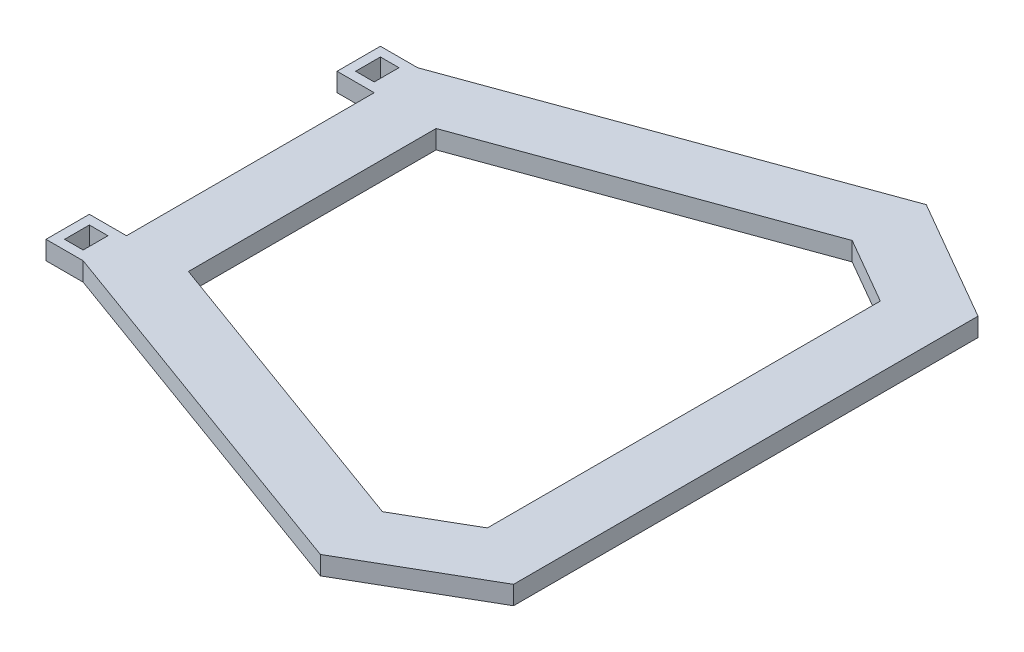
ISO-10303-21;
HEADER;
FILE_DESCRIPTION(('STEP AP214'),'2;1');
FILE_NAME('part.step','',(''),(''),'','','');
FILE_SCHEMA(('AUTOMOTIVE_DESIGN { 1 0 10303 214 1 1 1 1 }'));
ENDSEC;
DATA;
#1=APPLICATION_CONTEXT('core data for automotive mechanical design processes');
#2=APPLICATION_PROTOCOL_DEFINITION('international standard','automotive_design',2000,#1);
#3=PRODUCT_CONTEXT('',#1,'mechanical');
#4=PRODUCT('Part','Part','',(#3));
#5=PRODUCT_RELATED_PRODUCT_CATEGORY('part','',(#4));
#6=PRODUCT_DEFINITION_FORMATION('','',#4);
#7=PRODUCT_DEFINITION_CONTEXT('part definition',#1,'design');
#8=PRODUCT_DEFINITION('design','',#6,#7);
#9=PRODUCT_DEFINITION_SHAPE('','',#8);
#10=(LENGTH_UNIT() NAMED_UNIT(*) SI_UNIT(.MILLI.,.METRE.));
#11=(NAMED_UNIT(*) PLANE_ANGLE_UNIT() SI_UNIT($,.RADIAN.));
#12=(NAMED_UNIT(*) SI_UNIT($,.STERADIAN.) SOLID_ANGLE_UNIT());
#13=UNCERTAINTY_MEASURE_WITH_UNIT(LENGTH_MEASURE(1.E-05),#10,'distance_accuracy_value','');
#14=(GEOMETRIC_REPRESENTATION_CONTEXT(3) GLOBAL_UNCERTAINTY_ASSIGNED_CONTEXT((#13)) GLOBAL_UNIT_ASSIGNED_CONTEXT((#10,
#11,#12)) REPRESENTATION_CONTEXT('',''));
#15=CARTESIAN_POINT('',(0.,0.,0.));
#16=DIRECTION('',(0.,0.,1.));
#17=DIRECTION('',(1.,0.,0.));
#18=AXIS2_PLACEMENT_3D('',#15,#16,#17);
#19=CARTESIAN_POINT('',(-80.,-3.,-27.));
#20=DIRECTION('',(1.,0.,0.));
#21=DIRECTION('',(0.,0.,-1.));
#22=AXIS2_PLACEMENT_3D('',#19,#20,#21);
#23=PLANE('',#22);
#24=DIRECTION('',(0.,0.,-1.));
#25=VECTOR('',#24,1.);
#26=CARTESIAN_POINT('',(-80.,-3.,-27.));
#27=LINE('',#26,#25);
#28=CARTESIAN_POINT('',(-80.,-3.,20.));
#29=VERTEX_POINT('',#28);
#30=CARTESIAN_POINT('',(-80.,-3.,-20.));
#31=VERTEX_POINT('',#30);
#32=EDGE_CURVE('E59',#29,#31,#27,.T.);
#33=ORIENTED_EDGE('',*,*,#32,.F.);
#34=DIRECTION('',(0.,1.,0.));
#35=VECTOR('',#34,1.);
#36=CARTESIAN_POINT('',(-80.,-12.2195444572929,20.));
#37=LINE('',#36,#35);
#38=CARTESIAN_POINT('',(-80.,0.,20.));
#39=VERTEX_POINT('',#38);
#40=EDGE_CURVE('E64',#29,#39,#37,.T.);
#41=ORIENTED_EDGE('',*,*,#40,.T.);
#42=DIRECTION('',(0.,0.,-1.));
#43=VECTOR('',#42,1.);
#44=CARTESIAN_POINT('',(-80.,0.,-27.));
#45=LINE('',#44,#43);
#46=CARTESIAN_POINT('',(-80.,0.,-20.));
#47=VERTEX_POINT('',#46);
#48=EDGE_CURVE('E453',#39,#47,#45,.T.);
#49=ORIENTED_EDGE('',*,*,#48,.T.);
#50=DIRECTION('',(0.,1.,0.));
#51=VECTOR('',#50,1.);
#52=CARTESIAN_POINT('',(-80.,-12.2195444572929,-20.));
#53=LINE('',#52,#51);
#54=EDGE_CURVE('E346',#31,#47,#53,.T.);
#55=ORIENTED_EDGE('',*,*,#54,.F.);
#56=EDGE_LOOP('',(#33,#41,#49,#55));
#57=FACE_BOUND('',#56,.T.);
#58=ADVANCED_FACE('F43',(#57),#23,.F.);
#59=CARTESIAN_POINT('',(0.,-3.,0.));
#60=DIRECTION('',(0.,1.,0.));
#61=DIRECTION('',(0.,0.,1.));
#62=AXIS2_PLACEMENT_3D('',#59,#60,#61);
#63=PLANE('',#62);
#64=DIRECTION('',(0.866025403784439,0.,0.499999999999999));
#65=VECTOR('',#64,1.);
#66=CARTESIAN_POINT('',(0.,-3.,-37.5));
#67=LINE('',#66,#65);
#68=CARTESIAN_POINT('',(-19.7781931583833,-3.,-48.918945144077));
#69=VERTEX_POINT('',#68);
#70=CARTESIAN_POINT('',(0.,-3.,-37.5));
#71=VERTEX_POINT('',#70);
#72=EDGE_CURVE('E421',#69,#71,#67,.T.);
#73=ORIENTED_EDGE('',*,*,#72,.T.);
#74=DIRECTION('',(0.,0.,1.));
#75=VECTOR('',#74,1.);
#76=CARTESIAN_POINT('',(0.,-3.,37.5));
#77=LINE('',#76,#75);
#78=CARTESIAN_POINT('',(0.,-3.,37.5));
#79=VERTEX_POINT('',#78);
#80=EDGE_CURVE('E425',#71,#79,#77,.T.);
#81=ORIENTED_EDGE('',*,*,#80,.T.);
#82=DIRECTION('',(-0.866025403784439,0.,0.499999999999999));
#83=VECTOR('',#82,1.);
#84=CARTESIAN_POINT('',(0.,-3.,37.5));
#85=LINE('',#84,#83);
#86=CARTESIAN_POINT('',(-19.7781931583833,-3.,48.918945144077));
#87=VERTEX_POINT('',#86);
#88=EDGE_CURVE('E429',#79,#87,#85,.T.);
#89=ORIENTED_EDGE('',*,*,#88,.T.);
#90=DIRECTION('',(-0.93969262078591,0.,-0.342020143325665));
#91=VECTOR('',#90,1.);
#92=CARTESIAN_POINT('',(-19.7781931583833,-3.,48.918945144077));
#93=LINE('',#92,#91);
#94=CARTESIAN_POINT('',(-80.,-3.,27.));
#95=VERTEX_POINT('',#94);
#96=EDGE_CURVE('E432',#87,#95,#93,.T.);
#97=ORIENTED_EDGE('',*,*,#96,.T.);
#98=DIRECTION('',(-1.,0.,0.));
#99=VECTOR('',#98,1.);
#100=CARTESIAN_POINT('',(-80.,-3.,27.));
#101=LINE('',#100,#99);
#102=CARTESIAN_POINT('',(-86.,-3.,27.));
#103=VERTEX_POINT('',#102);
#104=EDGE_CURVE('E270',#95,#103,#101,.T.);
#105=ORIENTED_EDGE('',*,*,#104,.T.);
#106=DIRECTION('',(0.,0.,-1.));
#107=VECTOR('',#106,1.);
#108=CARTESIAN_POINT('',(-86.,-3.,27.));
#109=LINE('',#108,#107);
#110=CARTESIAN_POINT('',(-86.,-3.,20.));
#111=VERTEX_POINT('',#110);
#112=EDGE_CURVE('E273',#103,#111,#109,.T.);
#113=ORIENTED_EDGE('',*,*,#112,.T.);
#114=DIRECTION('',(1.,0.,0.));
#115=VECTOR('',#114,1.);
#116=CARTESIAN_POINT('',(-80.,-3.,20.));
#117=LINE('',#116,#115);
#118=EDGE_CURVE('E227',#111,#29,#117,.T.);
#119=ORIENTED_EDGE('',*,*,#118,.T.);
#120=ORIENTED_EDGE('',*,*,#32,.T.);
#121=DIRECTION('',(-1.,0.,0.));
#122=VECTOR('',#121,1.);
#123=CARTESIAN_POINT('',(-80.,-3.,-20.));
#124=LINE('',#123,#122);
#125=CARTESIAN_POINT('',(-86.,-3.,-20.));
#126=VERTEX_POINT('',#125);
#127=EDGE_CURVE('E295',#31,#126,#124,.T.);
#128=ORIENTED_EDGE('',*,*,#127,.T.);
#129=DIRECTION('',(0.,0.,-1.));
#130=VECTOR('',#129,1.);
#131=CARTESIAN_POINT('',(-86.,-3.,-27.));
#132=LINE('',#131,#130);
#133=CARTESIAN_POINT('',(-86.,-3.,-27.));
#134=VERTEX_POINT('',#133);
#135=EDGE_CURVE('E300',#126,#134,#132,.T.);
#136=ORIENTED_EDGE('',*,*,#135,.T.);
#137=DIRECTION('',(1.,0.,0.));
#138=VECTOR('',#137,1.);
#139=CARTESIAN_POINT('',(-80.,-3.,-27.));
#140=LINE('',#139,#138);
#141=CARTESIAN_POINT('',(-80.,-3.,-27.));
#142=VERTEX_POINT('',#141);
#143=EDGE_CURVE('E286',#134,#142,#140,.T.);
#144=ORIENTED_EDGE('',*,*,#143,.T.);
#145=DIRECTION('',(0.93969262078591,0.,-0.342020143325665));
#146=VECTOR('',#145,1.);
#147=CARTESIAN_POINT('',(-19.7781931583833,-3.,-48.918945144077));
#148=LINE('',#147,#146);
#149=EDGE_CURVE('E437',#142,#69,#148,.T.);
#150=ORIENTED_EDGE('',*,*,#149,.T.);
#151=EDGE_LOOP('',(#73,#81,#89,#97,#105,#113,#119,#120,#128,#136,#144,#150));
#152=FACE_BOUND('',#151,.T.);
#153=DIRECTION('',(-0.866025403784441,0.,0.499999999999996));
#154=VECTOR('',#153,1.);
#155=CARTESIAN_POINT('',(-10.,-3.,31.7264973081037));
#156=LINE('',#155,#154);
#157=CARTESIAN_POINT('',(-10.,-3.,31.7264973081037));
#158=VERTEX_POINT('',#157);
#159=CARTESIAN_POINT('',(-20.7398503789688,-3.,37.9271528154576));
#160=VERTEX_POINT('',#159);
#161=EDGE_CURVE('E358',#158,#160,#156,.T.);
#162=ORIENTED_EDGE('',*,*,#161,.F.);
#163=DIRECTION('',(0.,0.,1.));
#164=VECTOR('',#163,1.);
#165=CARTESIAN_POINT('',(-10.,-3.,31.7264973081037));
#166=LINE('',#165,#164);
#167=CARTESIAN_POINT('',(-10.,-3.,-31.7264973081037));
#168=VERTEX_POINT('',#167);
#169=EDGE_CURVE('E375',#168,#158,#166,.T.);
#170=ORIENTED_EDGE('',*,*,#169,.F.);
#171=DIRECTION('',(0.86602540378444,0.,0.499999999999998));
#172=VECTOR('',#171,1.);
#173=CARTESIAN_POINT('',(-10.,-3.,-31.7264973081037));
#174=LINE('',#173,#172);
#175=CARTESIAN_POINT('',(-20.7398503789687,-3.,-37.9271528154576));
#176=VERTEX_POINT('',#175);
#177=EDGE_CURVE('E371',#176,#168,#174,.T.);
#178=ORIENTED_EDGE('',*,*,#177,.F.);
#179=DIRECTION('',(0.93969262078591,0.,-0.342020143325666));
#180=VECTOR('',#179,1.);
#181=CARTESIAN_POINT('',(-20.7398503789687,-3.,-37.9271528154576));
#182=LINE('',#181,#180);
#183=CARTESIAN_POINT('',(-70.,-3.,-19.9979246179029));
#184=VERTEX_POINT('',#183);
#185=EDGE_CURVE('E368',#184,#176,#182,.T.);
#186=ORIENTED_EDGE('',*,*,#185,.F.);
#187=DIRECTION('',(0.,0.,-1.));
#188=VECTOR('',#187,1.);
#189=CARTESIAN_POINT('',(-70.,-3.,-19.9979246179029));
#190=LINE('',#189,#188);
#191=CARTESIAN_POINT('',(-70.,-3.,19.9979246179029));
#192=VERTEX_POINT('',#191);
#193=EDGE_CURVE('E365',#192,#184,#190,.T.);
#194=ORIENTED_EDGE('',*,*,#193,.F.);
#195=DIRECTION('',(-0.939692620785909,0.,-0.342020143325665));
#196=VECTOR('',#195,1.);
#197=CARTESIAN_POINT('',(-20.7398503789688,-3.,37.9271528154576));
#198=LINE('',#197,#196);
#199=EDGE_CURVE('E361',#160,#192,#198,.T.);
#200=ORIENTED_EDGE('',*,*,#199,.F.);
#201=EDGE_LOOP('',(#162,#170,#178,#186,#194,#200));
#202=FACE_BOUND('',#201,.T.);
#203=DIRECTION('',(1.,0.,0.));
#204=VECTOR('',#203,1.);
#205=CARTESIAN_POINT('',(-81.5,-3.,-25.5));
#206=LINE('',#205,#204);
#207=CARTESIAN_POINT('',(-84.5,-3.,-25.5));
#208=VERTEX_POINT('',#207);
#209=CARTESIAN_POINT('',(-81.5,-3.,-25.5));
#210=VERTEX_POINT('',#209);
#211=EDGE_CURVE('E303',#208,#210,#206,.T.);
#212=ORIENTED_EDGE('',*,*,#211,.F.);
#213=DIRECTION('',(0.,0.,-1.));
#214=VECTOR('',#213,1.);
#215=CARTESIAN_POINT('',(-84.5,-3.,-25.5));
#216=LINE('',#215,#214);
#217=CARTESIAN_POINT('',(-84.5,-3.,-21.5));
#218=VERTEX_POINT('',#217);
#219=EDGE_CURVE('E282',#218,#208,#216,.T.);
#220=ORIENTED_EDGE('',*,*,#219,.F.);
#221=DIRECTION('',(-1.,0.,0.));
#222=VECTOR('',#221,1.);
#223=CARTESIAN_POINT('',(-81.5,-3.,-21.5));
#224=LINE('',#223,#222);
#225=CARTESIAN_POINT('',(-81.5,-3.,-21.5));
#226=VERTEX_POINT('',#225);
#227=EDGE_CURVE('E287',#226,#218,#224,.T.);
#228=ORIENTED_EDGE('',*,*,#227,.F.);
#229=DIRECTION('',(0.,0.,1.));
#230=VECTOR('',#229,1.);
#231=CARTESIAN_POINT('',(-81.5,-3.,-25.5));
#232=LINE('',#231,#230);
#233=EDGE_CURVE('E291',#210,#226,#232,.T.);
#234=ORIENTED_EDGE('',*,*,#233,.F.);
#235=EDGE_LOOP('',(#212,#220,#228,#234));
#236=FACE_BOUND('',#235,.T.);
#237=DIRECTION('',(0.,0.,-1.));
#238=VECTOR('',#237,1.);
#239=CARTESIAN_POINT('',(-84.5,-3.,25.5));
#240=LINE('',#239,#238);
#241=CARTESIAN_POINT('',(-84.5,-3.,25.5));
#242=VERTEX_POINT('',#241);
#243=CARTESIAN_POINT('',(-84.5,-3.,21.5));
#244=VERTEX_POINT('',#243);
#245=EDGE_CURVE('E215',#242,#244,#240,.T.);
#246=ORIENTED_EDGE('',*,*,#245,.F.);
#247=DIRECTION('',(-1.,0.,0.));
#248=VECTOR('',#247,1.);
#249=CARTESIAN_POINT('',(-81.5,-3.,25.5));
#250=LINE('',#249,#248);
#251=CARTESIAN_POINT('',(-81.5,-3.,25.5));
#252=VERTEX_POINT('',#251);
#253=EDGE_CURVE('E218',#252,#242,#250,.T.);
#254=ORIENTED_EDGE('',*,*,#253,.F.);
#255=DIRECTION('',(0.,0.,1.));
#256=VECTOR('',#255,1.);
#257=CARTESIAN_POINT('',(-81.5,-3.,25.5));
#258=LINE('',#257,#256);
#259=CARTESIAN_POINT('',(-81.5,-3.,21.5));
#260=VERTEX_POINT('',#259);
#261=EDGE_CURVE('E237',#260,#252,#258,.T.);
#262=ORIENTED_EDGE('',*,*,#261,.F.);
#263=DIRECTION('',(1.,0.,0.));
#264=VECTOR('',#263,1.);
#265=CARTESIAN_POINT('',(-81.5,-3.,21.5));
#266=LINE('',#265,#264);
#267=EDGE_CURVE('E221',#244,#260,#266,.T.);
#268=ORIENTED_EDGE('',*,*,#267,.F.);
#269=EDGE_LOOP('',(#246,#254,#262,#268));
#270=FACE_BOUND('',#269,.T.);
#271=ADVANCED_FACE('F217',(#152,#202,#236,#270),#63,.F.);
#272=CARTESIAN_POINT('',(0.,0.,0.));
#273=DIRECTION('',(0.,1.,0.));
#274=DIRECTION('',(0.,0.,1.));
#275=AXIS2_PLACEMENT_3D('',#272,#273,#274);
#276=PLANE('',#275);
#277=DIRECTION('',(0.866025403784439,0.,0.499999999999999));
#278=VECTOR('',#277,1.);
#279=CARTESIAN_POINT('',(0.,0.,-37.5));
#280=LINE('',#279,#278);
#281=CARTESIAN_POINT('',(-19.7781931583833,0.,-48.918945144077));
#282=VERTEX_POINT('',#281);
#283=CARTESIAN_POINT('',(0.,0.,-37.5));
#284=VERTEX_POINT('',#283);
#285=EDGE_CURVE('E420',#282,#284,#280,.T.);
#286=ORIENTED_EDGE('',*,*,#285,.F.);
#287=DIRECTION('',(0.93969262078591,0.,-0.342020143325665));
#288=VECTOR('',#287,1.);
#289=CARTESIAN_POINT('',(-19.7781931583833,0.,-48.918945144077));
#290=LINE('',#289,#288);
#291=CARTESIAN_POINT('',(-80.,0.,-27.));
#292=VERTEX_POINT('',#291);
#293=EDGE_CURVE('E426',#292,#282,#290,.T.);
#294=ORIENTED_EDGE('',*,*,#293,.F.);
#295=DIRECTION('',(-1.,0.,0.));
#296=VECTOR('',#295,1.);
#297=CARTESIAN_POINT('',(-80.,0.,-27.));
#298=LINE('',#297,#296);
#299=CARTESIAN_POINT('',(-86.,0.,-27.));
#300=VERTEX_POINT('',#299);
#301=EDGE_CURVE('E325',#292,#300,#298,.T.);
#302=ORIENTED_EDGE('',*,*,#301,.T.);
#303=DIRECTION('',(0.,0.,1.));
#304=VECTOR('',#303,1.);
#305=CARTESIAN_POINT('',(-86.,0.,-27.));
#306=LINE('',#305,#304);
#307=CARTESIAN_POINT('',(-86.,0.,-20.));
#308=VERTEX_POINT('',#307);
#309=EDGE_CURVE('E337',#300,#308,#306,.T.);
#310=ORIENTED_EDGE('',*,*,#309,.T.);
#311=DIRECTION('',(1.,0.,0.));
#312=VECTOR('',#311,1.);
#313=CARTESIAN_POINT('',(-80.,0.,-20.));
#314=LINE('',#313,#312);
#315=EDGE_CURVE('E341',#308,#47,#314,.T.);
#316=ORIENTED_EDGE('',*,*,#315,.T.);
#317=ORIENTED_EDGE('',*,*,#48,.F.);
#318=DIRECTION('',(-1.,0.,0.));
#319=VECTOR('',#318,1.);
#320=CARTESIAN_POINT('',(-80.,0.,20.));
#321=LINE('',#320,#319);
#322=CARTESIAN_POINT('',(-86.,0.,20.));
#323=VERTEX_POINT('',#322);
#324=EDGE_CURVE('E518',#39,#323,#321,.T.);
#325=ORIENTED_EDGE('',*,*,#324,.T.);
#326=DIRECTION('',(0.,0.,1.));
#327=VECTOR('',#326,1.);
#328=CARTESIAN_POINT('',(-86.,0.,27.));
#329=LINE('',#328,#327);
#330=CARTESIAN_POINT('',(-86.,0.,27.));
#331=VERTEX_POINT('',#330);
#332=EDGE_CURVE('E505',#323,#331,#329,.T.);
#333=ORIENTED_EDGE('',*,*,#332,.T.);
#334=DIRECTION('',(1.,0.,0.));
#335=VECTOR('',#334,1.);
#336=CARTESIAN_POINT('',(-80.,0.,27.));
#337=LINE('',#336,#335);
#338=CARTESIAN_POINT('',(-80.,0.,27.));
#339=VERTEX_POINT('',#338);
#340=EDGE_CURVE('E256',#331,#339,#337,.T.);
#341=ORIENTED_EDGE('',*,*,#340,.T.);
#342=DIRECTION('',(-0.93969262078591,0.,-0.342020143325665));
#343=VECTOR('',#342,1.);
#344=CARTESIAN_POINT('',(-19.7781931583833,0.,48.918945144077));
#345=LINE('',#344,#343);
#346=CARTESIAN_POINT('',(-19.7781931583833,0.,48.918945144077));
#347=VERTEX_POINT('',#346);
#348=EDGE_CURVE('E450',#347,#339,#345,.T.);
#349=ORIENTED_EDGE('',*,*,#348,.F.);
#350=DIRECTION('',(-0.866025403784439,0.,0.499999999999999));
#351=VECTOR('',#350,1.);
#352=CARTESIAN_POINT('',(0.,0.,37.5));
#353=LINE('',#352,#351);
#354=CARTESIAN_POINT('',(0.,0.,37.5));
#355=VERTEX_POINT('',#354);
#356=EDGE_CURVE('E447',#355,#347,#353,.T.);
#357=ORIENTED_EDGE('',*,*,#356,.F.);
#358=DIRECTION('',(0.,0.,1.));
#359=VECTOR('',#358,1.);
#360=CARTESIAN_POINT('',(0.,0.,37.5));
#361=LINE('',#360,#359);
#362=EDGE_CURVE('E444',#284,#355,#361,.T.);
#363=ORIENTED_EDGE('',*,*,#362,.F.);
#364=EDGE_LOOP('',(#286,#294,#302,#310,#316,#317,#325,#333,#341,#349,#357,#363));
#365=FACE_BOUND('',#364,.T.);
#366=DIRECTION('',(0.,0.,1.));
#367=VECTOR('',#366,1.);
#368=CARTESIAN_POINT('',(-10.,0.,31.7264973081037));
#369=LINE('',#368,#367);
#370=CARTESIAN_POINT('',(-10.,0.,-31.7264973081037));
#371=VERTEX_POINT('',#370);
#372=CARTESIAN_POINT('',(-10.,0.,31.7264973081037));
#373=VERTEX_POINT('',#372);
#374=EDGE_CURVE('E362',#371,#373,#369,.T.);
#375=ORIENTED_EDGE('',*,*,#374,.T.);
#376=DIRECTION('',(-0.866025403784441,0.,0.499999999999996));
#377=VECTOR('',#376,1.);
#378=CARTESIAN_POINT('',(-10.,0.,31.7264973081037));
#379=LINE('',#378,#377);
#380=CARTESIAN_POINT('',(-20.7398503789688,0.,37.9271528154576));
#381=VERTEX_POINT('',#380);
#382=EDGE_CURVE('E299',#373,#381,#379,.T.);
#383=ORIENTED_EDGE('',*,*,#382,.T.);
#384=DIRECTION('',(-0.939692620785909,0.,-0.342020143325665));
#385=VECTOR('',#384,1.);
#386=CARTESIAN_POINT('',(-20.7398503789688,0.,37.9271528154576));
#387=LINE('',#386,#385);
#388=CARTESIAN_POINT('',(-70.,0.,19.9979246179029));
#389=VERTEX_POINT('',#388);
#390=EDGE_CURVE('E382',#381,#389,#387,.T.);
#391=ORIENTED_EDGE('',*,*,#390,.T.);
#392=DIRECTION('',(0.,0.,-1.));
#393=VECTOR('',#392,1.);
#394=CARTESIAN_POINT('',(-70.,0.,-19.9979246179029));
#395=LINE('',#394,#393);
#396=CARTESIAN_POINT('',(-70.,0.,-19.9979246179029));
#397=VERTEX_POINT('',#396);
#398=EDGE_CURVE('E386',#389,#397,#395,.T.);
#399=ORIENTED_EDGE('',*,*,#398,.T.);
#400=DIRECTION('',(0.93969262078591,0.,-0.342020143325666));
#401=VECTOR('',#400,1.);
#402=CARTESIAN_POINT('',(-20.7398503789687,0.,-37.9271528154576));
#403=LINE('',#402,#401);
#404=CARTESIAN_POINT('',(-20.7398503789687,0.,-37.9271528154576));
#405=VERTEX_POINT('',#404);
#406=EDGE_CURVE('E390',#397,#405,#403,.T.);
#407=ORIENTED_EDGE('',*,*,#406,.T.);
#408=DIRECTION('',(0.86602540378444,0.,0.499999999999998));
#409=VECTOR('',#408,1.);
#410=CARTESIAN_POINT('',(-10.,0.,-31.7264973081037));
#411=LINE('',#410,#409);
#412=EDGE_CURVE('E394',#405,#371,#411,.T.);
#413=ORIENTED_EDGE('',*,*,#412,.T.);
#414=EDGE_LOOP('',(#375,#383,#391,#399,#407,#413));
#415=FACE_BOUND('',#414,.T.);
#416=DIRECTION('',(-1.,0.,0.));
#417=VECTOR('',#416,1.);
#418=CARTESIAN_POINT('',(-81.5,0.,-25.5));
#419=LINE('',#418,#417);
#420=CARTESIAN_POINT('',(-81.5,0.,-25.5));
#421=VERTEX_POINT('',#420);
#422=CARTESIAN_POINT('',(-84.5,0.,-25.5));
#423=VERTEX_POINT('',#422);
#424=EDGE_CURVE('E309',#421,#423,#419,.T.);
#425=ORIENTED_EDGE('',*,*,#424,.F.);
#426=DIRECTION('',(0.,0.,-1.));
#427=VECTOR('',#426,1.);
#428=CARTESIAN_POINT('',(-81.5,0.,-25.5));
#429=LINE('',#428,#427);
#430=CARTESIAN_POINT('',(-81.5,0.,-21.5));
#431=VERTEX_POINT('',#430);
#432=EDGE_CURVE('E269',#431,#421,#429,.T.);
#433=ORIENTED_EDGE('',*,*,#432,.F.);
#434=DIRECTION('',(1.,0.,0.));
#435=VECTOR('',#434,1.);
#436=CARTESIAN_POINT('',(-81.5,0.,-21.5));
#437=LINE('',#436,#435);
#438=CARTESIAN_POINT('',(-84.5,0.,-21.5));
#439=VERTEX_POINT('',#438);
#440=EDGE_CURVE('E317',#439,#431,#437,.T.);
#441=ORIENTED_EDGE('',*,*,#440,.F.);
#442=DIRECTION('',(0.,0.,1.));
#443=VECTOR('',#442,1.);
#444=CARTESIAN_POINT('',(-84.5,0.,-25.5));
#445=LINE('',#444,#443);
#446=EDGE_CURVE('E313',#423,#439,#445,.T.);
#447=ORIENTED_EDGE('',*,*,#446,.F.);
#448=EDGE_LOOP('',(#425,#433,#441,#447));
#449=FACE_BOUND('',#448,.T.);
#450=DIRECTION('',(0.,0.,1.));
#451=VECTOR('',#450,1.);
#452=CARTESIAN_POINT('',(-84.5,0.,25.5));
#453=LINE('',#452,#451);
#454=CARTESIAN_POINT('',(-84.5,0.,21.5));
#455=VERTEX_POINT('',#454);
#456=CARTESIAN_POINT('',(-84.5,0.,25.5));
#457=VERTEX_POINT('',#456);
#458=EDGE_CURVE('E241',#455,#457,#453,.T.);
#459=ORIENTED_EDGE('',*,*,#458,.F.);
#460=DIRECTION('',(-1.,0.,0.));
#461=VECTOR('',#460,1.);
#462=CARTESIAN_POINT('',(-81.5,0.,21.5));
#463=LINE('',#462,#461);
#464=CARTESIAN_POINT('',(-81.5,0.,21.5));
#465=VERTEX_POINT('',#464);
#466=EDGE_CURVE('E265',#465,#455,#463,.T.);
#467=ORIENTED_EDGE('',*,*,#466,.F.);
#468=DIRECTION('',(0.,0.,-1.));
#469=VECTOR('',#468,1.);
#470=CARTESIAN_POINT('',(-81.5,0.,25.5));
#471=LINE('',#470,#469);
#472=CARTESIAN_POINT('',(-81.5,0.,25.5));
#473=VERTEX_POINT('',#472);
#474=EDGE_CURVE('E248',#473,#465,#471,.T.);
#475=ORIENTED_EDGE('',*,*,#474,.F.);
#476=DIRECTION('',(1.,0.,0.));
#477=VECTOR('',#476,1.);
#478=CARTESIAN_POINT('',(-81.5,0.,25.5));
#479=LINE('',#478,#477);
#480=EDGE_CURVE('E260',#457,#473,#479,.T.);
#481=ORIENTED_EDGE('',*,*,#480,.F.);
#482=EDGE_LOOP('',(#459,#467,#475,#481));
#483=FACE_BOUND('',#482,.T.);
#484=ADVANCED_FACE('F483',(#365,#415,#449,#483),#276,.T.);
#485=CARTESIAN_POINT('',(0.,-3.,-37.5));
#486=DIRECTION('',(-0.499999999999999,0.,0.866025403784439));
#487=DIRECTION('',(0.866025403784439,0.,0.499999999999999));
#488=AXIS2_PLACEMENT_3D('',#485,#486,#487);
#489=PLANE('',#488);
#490=ORIENTED_EDGE('',*,*,#285,.T.);
#491=DIRECTION('',(0.,1.,0.));
#492=VECTOR('',#491,1.);
#493=CARTESIAN_POINT('',(0.,-3.,-37.5));
#494=LINE('',#493,#492);
#495=EDGE_CURVE('E11',#71,#284,#494,.T.);
#496=ORIENTED_EDGE('',*,*,#495,.F.);
#497=ORIENTED_EDGE('',*,*,#72,.F.);
#498=DIRECTION('',(0.,1.,0.));
#499=VECTOR('',#498,1.);
#500=CARTESIAN_POINT('',(-19.7781931583833,-3.,-48.918945144077));
#501=LINE('',#500,#499);
#502=EDGE_CURVE('E440',#69,#282,#501,.T.);
#503=ORIENTED_EDGE('',*,*,#502,.T.);
#504=EDGE_LOOP('',(#490,#496,#497,#503));
#505=FACE_BOUND('',#504,.T.);
#506=ADVANCED_FACE('F45',(#505),#489,.F.);
#507=CARTESIAN_POINT('',(0.,-3.,37.5));
#508=DIRECTION('',(-1.,0.,0.));
#509=DIRECTION('',(0.,0.,1.));
#510=AXIS2_PLACEMENT_3D('',#507,#508,#509);
#511=PLANE('',#510);
#512=ORIENTED_EDGE('',*,*,#362,.T.);
#513=DIRECTION('',(0.,1.,0.));
#514=VECTOR('',#513,1.);
#515=CARTESIAN_POINT('',(0.,-3.,37.5));
#516=LINE('',#515,#514);
#517=EDGE_CURVE('E52',#79,#355,#516,.T.);
#518=ORIENTED_EDGE('',*,*,#517,.F.);
#519=ORIENTED_EDGE('',*,*,#80,.F.);
#520=ORIENTED_EDGE('',*,*,#495,.T.);
#521=EDGE_LOOP('',(#512,#518,#519,#520));
#522=FACE_BOUND('',#521,.T.);
#523=ADVANCED_FACE('F544',(#522),#511,.F.);
#524=CARTESIAN_POINT('',(0.,-3.,37.5));
#525=DIRECTION('',(-0.499999999999999,0.,-0.866025403784439));
#526=DIRECTION('',(-0.866025403784439,0.,0.499999999999999));
#527=AXIS2_PLACEMENT_3D('',#524,#525,#526);
#528=PLANE('',#527);
#529=ORIENTED_EDGE('',*,*,#356,.T.);
#530=DIRECTION('',(0.,1.,0.));
#531=VECTOR('',#530,1.);
#532=CARTESIAN_POINT('',(-19.7781931583833,-3.,48.918945144077));
#533=LINE('',#532,#531);
#534=EDGE_CURVE('E468',#87,#347,#533,.T.);
#535=ORIENTED_EDGE('',*,*,#534,.F.);
#536=ORIENTED_EDGE('',*,*,#88,.F.);
#537=ORIENTED_EDGE('',*,*,#517,.T.);
#538=EDGE_LOOP('',(#529,#535,#536,#537));
#539=FACE_BOUND('',#538,.T.);
#540=ADVANCED_FACE('F477',(#539),#528,.F.);
#541=CARTESIAN_POINT('',(-19.7781931583833,-3.,48.918945144077));
#542=DIRECTION('',(0.342020143325665,0.,-0.93969262078591));
#543=DIRECTION('',(-0.93969262078591,0.,-0.342020143325665));
#544=AXIS2_PLACEMENT_3D('',#541,#542,#543);
#545=PLANE('',#544);
#546=ORIENTED_EDGE('',*,*,#348,.T.);
#547=DIRECTION('',(0.,1.,0.));
#548=VECTOR('',#547,1.);
#549=CARTESIAN_POINT('',(-80.,-3.,27.));
#550=LINE('',#549,#548);
#551=EDGE_CURVE('E464',#95,#339,#550,.T.);
#552=ORIENTED_EDGE('',*,*,#551,.F.);
#553=ORIENTED_EDGE('',*,*,#96,.F.);
#554=ORIENTED_EDGE('',*,*,#534,.T.);
#555=EDGE_LOOP('',(#546,#552,#553,#554));
#556=FACE_BOUND('',#555,.T.);
#557=ADVANCED_FACE('F490',(#556),#545,.F.);
#558=CARTESIAN_POINT('',(-19.7781931583833,-3.,-48.918945144077));
#559=DIRECTION('',(0.342020143325665,0.,0.93969262078591));
#560=DIRECTION('',(0.93969262078591,0.,-0.342020143325665));
#561=AXIS2_PLACEMENT_3D('',#558,#559,#560);
#562=PLANE('',#561);
#563=ORIENTED_EDGE('',*,*,#293,.T.);
#564=ORIENTED_EDGE('',*,*,#502,.F.);
#565=ORIENTED_EDGE('',*,*,#149,.F.);
#566=DIRECTION('',(0.,1.,0.));
#567=VECTOR('',#566,1.);
#568=CARTESIAN_POINT('',(-80.,-3.,-27.));
#569=LINE('',#568,#567);
#570=EDGE_CURVE('E461',#142,#292,#569,.T.);
#571=ORIENTED_EDGE('',*,*,#570,.T.);
#572=EDGE_LOOP('',(#563,#564,#565,#571));
#573=FACE_BOUND('',#572,.T.);
#574=ADVANCED_FACE('F542',(#573),#562,.F.);
#575=CARTESIAN_POINT('',(-10.,-3.,31.7264973081037));
#576=DIRECTION('',(-0.499999999999996,0.,-0.866025403784441));
#577=DIRECTION('',(-0.866025403784441,0.,0.499999999999996));
#578=AXIS2_PLACEMENT_3D('',#575,#576,#577);
#579=PLANE('',#578);
#580=ORIENTED_EDGE('',*,*,#382,.F.);
#581=DIRECTION('',(0.,1.,0.));
#582=VECTOR('',#581,1.);
#583=CARTESIAN_POINT('',(-10.,-3.,31.7264973081037));
#584=LINE('',#583,#582);
#585=EDGE_CURVE('E378',#158,#373,#584,.T.);
#586=ORIENTED_EDGE('',*,*,#585,.F.);
#587=ORIENTED_EDGE('',*,*,#161,.T.);
#588=DIRECTION('',(0.,1.,0.));
#589=VECTOR('',#588,1.);
#590=CARTESIAN_POINT('',(-20.7398503789688,-3.,37.9271528154576));
#591=LINE('',#590,#589);
#592=EDGE_CURVE('E416',#160,#381,#591,.T.);
#593=ORIENTED_EDGE('',*,*,#592,.T.);
#594=EDGE_LOOP('',(#580,#586,#587,#593));
#595=FACE_BOUND('',#594,.T.);
#596=ADVANCED_FACE('F564',(#595),#579,.T.);
#597=CARTESIAN_POINT('',(-20.7398503789688,-3.,37.9271528154576));
#598=DIRECTION('',(0.342020143325666,0.,-0.93969262078591));
#599=DIRECTION('',(-0.93969262078591,0.,-0.342020143325666));
#600=AXIS2_PLACEMENT_3D('',#597,#598,#599);
#601=PLANE('',#600);
#602=ORIENTED_EDGE('',*,*,#390,.F.);
#603=ORIENTED_EDGE('',*,*,#592,.F.);
#604=ORIENTED_EDGE('',*,*,#199,.T.);
#605=DIRECTION('',(0.,1.,0.));
#606=VECTOR('',#605,1.);
#607=CARTESIAN_POINT('',(-70.,-3.,19.9979246179029));
#608=LINE('',#607,#606);
#609=EDGE_CURVE('E413',#192,#389,#608,.T.);
#610=ORIENTED_EDGE('',*,*,#609,.T.);
#611=EDGE_LOOP('',(#602,#603,#604,#610));
#612=FACE_BOUND('',#611,.T.);
#613=ADVANCED_FACE('F568',(#612),#601,.T.);
#614=CARTESIAN_POINT('',(-70.,-3.,-19.9979246179029));
#615=DIRECTION('',(1.,0.,0.));
#616=DIRECTION('',(0.,0.,-1.));
#617=AXIS2_PLACEMENT_3D('',#614,#615,#616);
#618=PLANE('',#617);
#619=ORIENTED_EDGE('',*,*,#398,.F.);
#620=ORIENTED_EDGE('',*,*,#609,.F.);
#621=ORIENTED_EDGE('',*,*,#193,.T.);
#622=DIRECTION('',(0.,1.,0.));
#623=VECTOR('',#622,1.);
#624=CARTESIAN_POINT('',(-70.,-3.,-19.9979246179029));
#625=LINE('',#624,#623);
#626=EDGE_CURVE('E410',#184,#397,#625,.T.);
#627=ORIENTED_EDGE('',*,*,#626,.T.);
#628=EDGE_LOOP('',(#619,#620,#621,#627));
#629=FACE_BOUND('',#628,.T.);
#630=ADVANCED_FACE('F574',(#629),#618,.T.);
#631=CARTESIAN_POINT('',(-20.7398503789687,-3.,-37.9271528154576));
#632=DIRECTION('',(0.342020143325665,0.,0.93969262078591));
#633=DIRECTION('',(0.93969262078591,0.,-0.342020143325665));
#634=AXIS2_PLACEMENT_3D('',#631,#632,#633);
#635=PLANE('',#634);
#636=ORIENTED_EDGE('',*,*,#406,.F.);
#637=ORIENTED_EDGE('',*,*,#626,.F.);
#638=ORIENTED_EDGE('',*,*,#185,.T.);
#639=DIRECTION('',(0.,1.,0.));
#640=VECTOR('',#639,1.);
#641=CARTESIAN_POINT('',(-20.7398503789687,-3.,-37.9271528154576));
#642=LINE('',#641,#640);
#643=EDGE_CURVE('E407',#176,#405,#642,.T.);
#644=ORIENTED_EDGE('',*,*,#643,.T.);
#645=EDGE_LOOP('',(#636,#637,#638,#644));
#646=FACE_BOUND('',#645,.T.);
#647=ADVANCED_FACE('F624',(#646),#635,.T.);
#648=CARTESIAN_POINT('',(-10.,-3.,-31.7264973081037));
#649=DIRECTION('',(-0.499999999999998,0.,0.86602540378444));
#650=DIRECTION('',(0.86602540378444,0.,0.499999999999998));
#651=AXIS2_PLACEMENT_3D('',#648,#649,#650);
#652=PLANE('',#651);
#653=ORIENTED_EDGE('',*,*,#412,.F.);
#654=ORIENTED_EDGE('',*,*,#643,.F.);
#655=ORIENTED_EDGE('',*,*,#177,.T.);
#656=DIRECTION('',(0.,1.,0.));
#657=VECTOR('',#656,1.);
#658=CARTESIAN_POINT('',(-10.,-3.,-31.7264973081037));
#659=LINE('',#658,#657);
#660=EDGE_CURVE('E404',#168,#371,#659,.T.);
#661=ORIENTED_EDGE('',*,*,#660,.T.);
#662=EDGE_LOOP('',(#653,#654,#655,#661));
#663=FACE_BOUND('',#662,.T.);
#664=ADVANCED_FACE('F634',(#663),#652,.T.);
#665=CARTESIAN_POINT('',(-10.,-3.,31.7264973081037));
#666=DIRECTION('',(-1.,0.,0.));
#667=DIRECTION('',(0.,0.,1.));
#668=AXIS2_PLACEMENT_3D('',#665,#666,#667);
#669=PLANE('',#668);
#670=ORIENTED_EDGE('',*,*,#374,.F.);
#671=ORIENTED_EDGE('',*,*,#660,.F.);
#672=ORIENTED_EDGE('',*,*,#169,.T.);
#673=ORIENTED_EDGE('',*,*,#585,.T.);
#674=EDGE_LOOP('',(#670,#671,#672,#673));
#675=FACE_BOUND('',#674,.T.);
#676=ADVANCED_FACE('F645',(#675),#669,.T.);
#677=CARTESIAN_POINT('',(-80.,-12.2195444572929,-27.));
#678=DIRECTION('',(0.,0.,-1.));
#679=DIRECTION('',(-1.,0.,0.));
#680=AXIS2_PLACEMENT_3D('',#677,#678,#679);
#681=PLANE('',#680);
#682=ORIENTED_EDGE('',*,*,#143,.F.);
#683=DIRECTION('',(0.,1.,0.));
#684=VECTOR('',#683,1.);
#685=CARTESIAN_POINT('',(-86.,-12.2195444572929,-27.));
#686=LINE('',#685,#684);
#687=EDGE_CURVE('E345',#134,#300,#686,.T.);
#688=ORIENTED_EDGE('',*,*,#687,.T.);
#689=ORIENTED_EDGE('',*,*,#301,.F.);
#690=ORIENTED_EDGE('',*,*,#570,.F.);
#691=EDGE_LOOP('',(#682,#688,#689,#690));
#692=FACE_BOUND('',#691,.T.);
#693=ADVANCED_FACE('F537',(#692),#681,.T.);
#694=CARTESIAN_POINT('',(-86.,-12.2195444572929,-27.));
#695=DIRECTION('',(-1.,0.,0.));
#696=DIRECTION('',(0.,0.,1.));
#697=AXIS2_PLACEMENT_3D('',#694,#695,#696);
#698=PLANE('',#697);
#699=ORIENTED_EDGE('',*,*,#135,.F.);
#700=DIRECTION('',(0.,1.,0.));
#701=VECTOR('',#700,1.);
#702=CARTESIAN_POINT('',(-86.,-12.2195444572929,-20.));
#703=LINE('',#702,#701);
#704=EDGE_CURVE('E350',#126,#308,#703,.T.);
#705=ORIENTED_EDGE('',*,*,#704,.T.);
#706=ORIENTED_EDGE('',*,*,#309,.F.);
#707=ORIENTED_EDGE('',*,*,#687,.F.);
#708=EDGE_LOOP('',(#699,#705,#706,#707));
#709=FACE_BOUND('',#708,.T.);
#710=ADVANCED_FACE('F530',(#709),#698,.T.);
#711=CARTESIAN_POINT('',(-80.,-12.2195444572929,-20.));
#712=DIRECTION('',(0.,0.,1.));
#713=DIRECTION('',(1.,0.,0.));
#714=AXIS2_PLACEMENT_3D('',#711,#712,#713);
#715=PLANE('',#714);
#716=ORIENTED_EDGE('',*,*,#127,.F.);
#717=ORIENTED_EDGE('',*,*,#54,.T.);
#718=ORIENTED_EDGE('',*,*,#315,.F.);
#719=ORIENTED_EDGE('',*,*,#704,.F.);
#720=EDGE_LOOP('',(#716,#717,#718,#719));
#721=FACE_BOUND('',#720,.T.);
#722=ADVANCED_FACE('F527',(#721),#715,.T.);
#723=CARTESIAN_POINT('',(-81.5,-12.2195444572929,-25.5));
#724=DIRECTION('',(0.,0.,-1.));
#725=DIRECTION('',(-1.,0.,0.));
#726=AXIS2_PLACEMENT_3D('',#723,#724,#725);
#727=PLANE('',#726);
#728=DIRECTION('',(0.,1.,0.));
#729=VECTOR('',#728,1.);
#730=CARTESIAN_POINT('',(-84.5,-12.2195444572929,-25.5));
#731=LINE('',#730,#729);
#732=EDGE_CURVE('E329',#208,#423,#731,.T.);
#733=ORIENTED_EDGE('',*,*,#732,.F.);
#734=ORIENTED_EDGE('',*,*,#211,.T.);
#735=DIRECTION('',(0.,1.,0.));
#736=VECTOR('',#735,1.);
#737=CARTESIAN_POINT('',(-81.5,-12.2195444572929,-25.5));
#738=LINE('',#737,#736);
#739=EDGE_CURVE('E321',#210,#421,#738,.T.);
#740=ORIENTED_EDGE('',*,*,#739,.T.);
#741=ORIENTED_EDGE('',*,*,#424,.T.);
#742=EDGE_LOOP('',(#733,#734,#740,#741));
#743=FACE_BOUND('',#742,.T.);
#744=ADVANCED_FACE('F706',(#743),#727,.F.);
#745=CARTESIAN_POINT('',(-84.5,-12.2195444572929,-25.5));
#746=DIRECTION('',(-1.,0.,0.));
#747=DIRECTION('',(0.,0.,1.));
#748=AXIS2_PLACEMENT_3D('',#745,#746,#747);
#749=PLANE('',#748);
#750=DIRECTION('',(0.,1.,0.));
#751=VECTOR('',#750,1.);
#752=CARTESIAN_POINT('',(-84.5,-12.2195444572929,-21.5));
#753=LINE('',#752,#751);
#754=EDGE_CURVE('E326',#218,#439,#753,.T.);
#755=ORIENTED_EDGE('',*,*,#754,.F.);
#756=ORIENTED_EDGE('',*,*,#219,.T.);
#757=ORIENTED_EDGE('',*,*,#732,.T.);
#758=ORIENTED_EDGE('',*,*,#446,.T.);
#759=EDGE_LOOP('',(#755,#756,#757,#758));
#760=FACE_BOUND('',#759,.T.);
#761=ADVANCED_FACE('F716',(#760),#749,.F.);
#762=CARTESIAN_POINT('',(-81.5,-12.2195444572929,-21.5));
#763=DIRECTION('',(0.,0.,1.));
#764=DIRECTION('',(1.,0.,0.));
#765=AXIS2_PLACEMENT_3D('',#762,#763,#764);
#766=PLANE('',#765);
#767=DIRECTION('',(0.,1.,0.));
#768=VECTOR('',#767,1.);
#769=CARTESIAN_POINT('',(-81.5,-12.2195444572929,-21.5));
#770=LINE('',#769,#768);
#771=EDGE_CURVE('E322',#226,#431,#770,.T.);
#772=ORIENTED_EDGE('',*,*,#771,.F.);
#773=ORIENTED_EDGE('',*,*,#227,.T.);
#774=ORIENTED_EDGE('',*,*,#754,.T.);
#775=ORIENTED_EDGE('',*,*,#440,.T.);
#776=EDGE_LOOP('',(#772,#773,#774,#775));
#777=FACE_BOUND('',#776,.T.);
#778=ADVANCED_FACE('F727',(#777),#766,.F.);
#779=CARTESIAN_POINT('',(-81.5,-12.2195444572929,-25.5));
#780=DIRECTION('',(1.,0.,0.));
#781=DIRECTION('',(0.,0.,-1.));
#782=AXIS2_PLACEMENT_3D('',#779,#780,#781);
#783=PLANE('',#782);
#784=ORIENTED_EDGE('',*,*,#739,.F.);
#785=ORIENTED_EDGE('',*,*,#233,.T.);
#786=ORIENTED_EDGE('',*,*,#771,.T.);
#787=ORIENTED_EDGE('',*,*,#432,.T.);
#788=EDGE_LOOP('',(#784,#785,#786,#787));
#789=FACE_BOUND('',#788,.T.);
#790=ADVANCED_FACE('F738',(#789),#783,.F.);
#791=CARTESIAN_POINT('',(-80.,-12.2195444572929,20.));
#792=DIRECTION('',(0.,0.,-1.));
#793=DIRECTION('',(-1.,0.,0.));
#794=AXIS2_PLACEMENT_3D('',#791,#792,#793);
#795=PLANE('',#794);
#796=ORIENTED_EDGE('',*,*,#118,.F.);
#797=DIRECTION('',(0.,1.,0.));
#798=VECTOR('',#797,1.);
#799=CARTESIAN_POINT('',(-86.,-12.2195444572929,20.));
#800=LINE('',#799,#798);
#801=EDGE_CURVE('E504',#111,#323,#800,.T.);
#802=ORIENTED_EDGE('',*,*,#801,.T.);
#803=ORIENTED_EDGE('',*,*,#324,.F.);
#804=ORIENTED_EDGE('',*,*,#40,.F.);
#805=EDGE_LOOP('',(#796,#802,#803,#804));
#806=FACE_BOUND('',#805,.T.);
#807=ADVANCED_FACE('F521',(#806),#795,.T.);
#808=CARTESIAN_POINT('',(-86.,-12.2195444572929,27.));
#809=DIRECTION('',(-1.,0.,0.));
#810=DIRECTION('',(0.,0.,1.));
#811=AXIS2_PLACEMENT_3D('',#808,#809,#810);
#812=PLANE('',#811);
#813=ORIENTED_EDGE('',*,*,#112,.F.);
#814=DIRECTION('',(0.,1.,0.));
#815=VECTOR('',#814,1.);
#816=CARTESIAN_POINT('',(-86.,-12.2195444572929,27.));
#817=LINE('',#816,#815);
#818=EDGE_CURVE('E226',#103,#331,#817,.T.);
#819=ORIENTED_EDGE('',*,*,#818,.T.);
#820=ORIENTED_EDGE('',*,*,#332,.F.);
#821=ORIENTED_EDGE('',*,*,#801,.F.);
#822=EDGE_LOOP('',(#813,#819,#820,#821));
#823=FACE_BOUND('',#822,.T.);
#824=ADVANCED_FACE('F502',(#823),#812,.T.);
#825=CARTESIAN_POINT('',(-80.,-12.2195444572929,27.));
#826=DIRECTION('',(0.,0.,1.));
#827=DIRECTION('',(1.,0.,0.));
#828=AXIS2_PLACEMENT_3D('',#825,#826,#827);
#829=PLANE('',#828);
#830=ORIENTED_EDGE('',*,*,#104,.F.);
#831=ORIENTED_EDGE('',*,*,#551,.T.);
#832=ORIENTED_EDGE('',*,*,#340,.F.);
#833=ORIENTED_EDGE('',*,*,#818,.F.);
#834=EDGE_LOOP('',(#830,#831,#832,#833));
#835=FACE_BOUND('',#834,.T.);
#836=ADVANCED_FACE('F494',(#835),#829,.T.);
#837=CARTESIAN_POINT('',(-84.5,-12.2195444572929,25.5));
#838=DIRECTION('',(-1.,0.,0.));
#839=DIRECTION('',(0.,0.,1.));
#840=AXIS2_PLACEMENT_3D('',#837,#838,#839);
#841=PLANE('',#840);
#842=DIRECTION('',(0.,1.,0.));
#843=VECTOR('',#842,1.);
#844=CARTESIAN_POINT('',(-84.5,-12.2195444572929,25.5));
#845=LINE('',#844,#843);
#846=EDGE_CURVE('E232',#242,#457,#845,.T.);
#847=ORIENTED_EDGE('',*,*,#846,.F.);
#848=ORIENTED_EDGE('',*,*,#245,.T.);
#849=DIRECTION('',(0.,1.,0.));
#850=VECTOR('',#849,1.);
#851=CARTESIAN_POINT('',(-84.5,-12.2195444572929,21.5));
#852=LINE('',#851,#850);
#853=EDGE_CURVE('E244',#244,#455,#852,.T.);
#854=ORIENTED_EDGE('',*,*,#853,.T.);
#855=ORIENTED_EDGE('',*,*,#458,.T.);
#856=EDGE_LOOP('',(#847,#848,#854,#855));
#857=FACE_BOUND('',#856,.T.);
#858=ADVANCED_FACE('F239',(#857),#841,.F.);
#859=CARTESIAN_POINT('',(-81.5,-12.2195444572929,25.5));
#860=DIRECTION('',(0.,0.,1.));
#861=DIRECTION('',(1.,0.,0.));
#862=AXIS2_PLACEMENT_3D('',#859,#860,#861);
#863=PLANE('',#862);
#864=DIRECTION('',(0.,1.,0.));
#865=VECTOR('',#864,1.);
#866=CARTESIAN_POINT('',(-81.5,-12.2195444572929,25.5));
#867=LINE('',#866,#865);
#868=EDGE_CURVE('E234',#252,#473,#867,.T.);
#869=ORIENTED_EDGE('',*,*,#868,.F.);
#870=ORIENTED_EDGE('',*,*,#253,.T.);
#871=ORIENTED_EDGE('',*,*,#846,.T.);
#872=ORIENTED_EDGE('',*,*,#480,.T.);
#873=EDGE_LOOP('',(#869,#870,#871,#872));
#874=FACE_BOUND('',#873,.T.);
#875=ADVANCED_FACE('F230',(#874),#863,.F.);
#876=CARTESIAN_POINT('',(-81.5,-12.2195444572929,25.5));
#877=DIRECTION('',(1.,0.,0.));
#878=DIRECTION('',(0.,0.,-1.));
#879=AXIS2_PLACEMENT_3D('',#876,#877,#878);
#880=PLANE('',#879);
#881=DIRECTION('',(0.,1.,0.));
#882=VECTOR('',#881,1.);
#883=CARTESIAN_POINT('',(-81.5,-12.2195444572929,21.5));
#884=LINE('',#883,#882);
#885=EDGE_CURVE('E250',#260,#465,#884,.T.);
#886=ORIENTED_EDGE('',*,*,#885,.F.);
#887=ORIENTED_EDGE('',*,*,#261,.T.);
#888=ORIENTED_EDGE('',*,*,#868,.T.);
#889=ORIENTED_EDGE('',*,*,#474,.T.);
#890=EDGE_LOOP('',(#886,#887,#888,#889));
#891=FACE_BOUND('',#890,.T.);
#892=ADVANCED_FACE('F795',(#891),#880,.F.);
#893=CARTESIAN_POINT('',(-81.5,-12.2195444572929,21.5));
#894=DIRECTION('',(0.,0.,-1.));
#895=DIRECTION('',(-1.,0.,0.));
#896=AXIS2_PLACEMENT_3D('',#893,#894,#895);
#897=PLANE('',#896);
#898=ORIENTED_EDGE('',*,*,#853,.F.);
#899=ORIENTED_EDGE('',*,*,#267,.T.);
#900=ORIENTED_EDGE('',*,*,#885,.T.);
#901=ORIENTED_EDGE('',*,*,#466,.T.);
#902=EDGE_LOOP('',(#898,#899,#900,#901));
#903=FACE_BOUND('',#902,.T.);
#904=ADVANCED_FACE('F805',(#903),#897,.F.);
#905=CLOSED_SHELL('',(#58,#271,#484,#506,#523,#540,#557,#574,#596,#613,#630,#647,#664,#676,#693,
#710,#722,#744,#761,#778,#790,#807,#824,#836,#858,#875,#892,#904));
#906=MANIFOLD_SOLID_BREP('B2',#905);
#907=ADVANCED_BREP_SHAPE_REPRESENTATION('',(#18,#906),#14);
#908=SHAPE_DEFINITION_REPRESENTATION(#9,#907);
ENDSEC;
END-ISO-10303-21;
